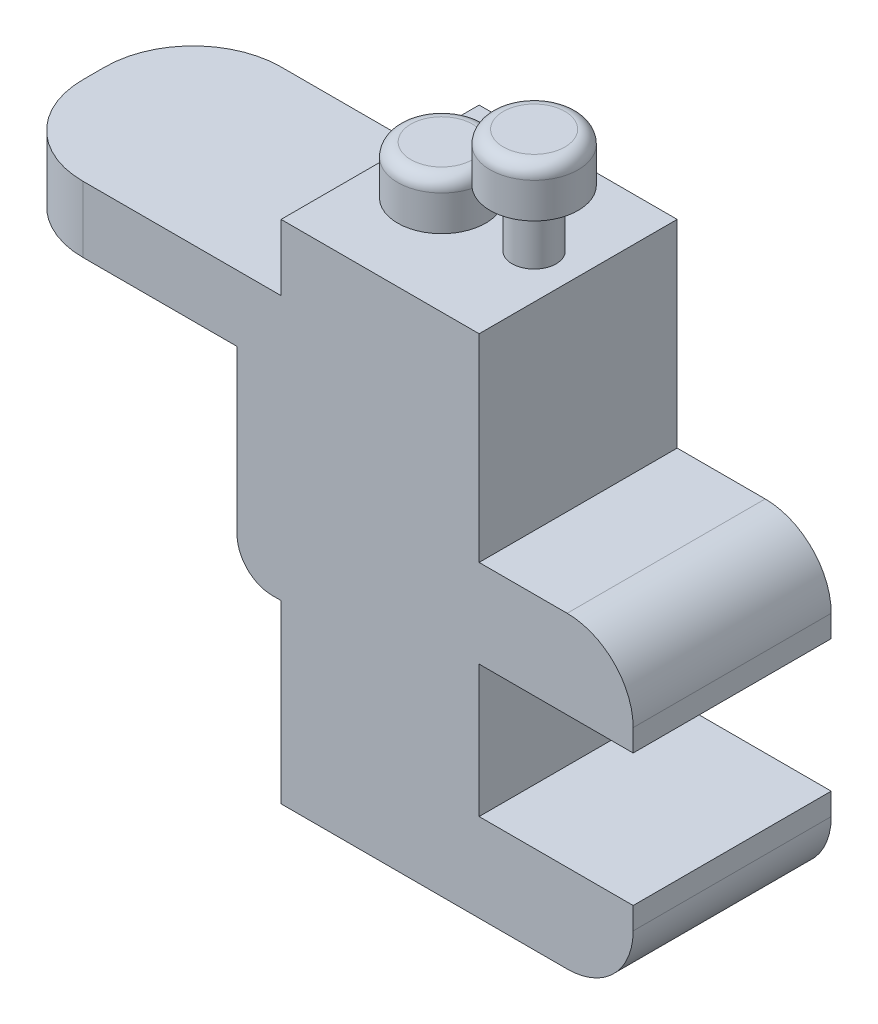
ISO-10303-21;
HEADER;
FILE_DESCRIPTION(('STEP AP214'),'2;1');
FILE_NAME('part.step','',(''),(''),'','','');
FILE_SCHEMA(('AUTOMOTIVE_DESIGN { 1 0 10303 214 1 1 1 1 }'));
ENDSEC;
DATA;
#1=APPLICATION_CONTEXT('core data for automotive mechanical design processes');
#2=APPLICATION_PROTOCOL_DEFINITION('international standard','automotive_design',2000,#1);
#3=PRODUCT_CONTEXT('',#1,'mechanical');
#4=PRODUCT('Part','Part','',(#3));
#5=PRODUCT_RELATED_PRODUCT_CATEGORY('part','',(#4));
#6=PRODUCT_DEFINITION_FORMATION('','',#4);
#7=PRODUCT_DEFINITION_CONTEXT('part definition',#1,'design');
#8=PRODUCT_DEFINITION('design','',#6,#7);
#9=PRODUCT_DEFINITION_SHAPE('','',#8);
#10=(LENGTH_UNIT() NAMED_UNIT(*) SI_UNIT(.MILLI.,.METRE.));
#11=(NAMED_UNIT(*) PLANE_ANGLE_UNIT() SI_UNIT($,.RADIAN.));
#12=(NAMED_UNIT(*) SI_UNIT($,.STERADIAN.) SOLID_ANGLE_UNIT());
#13=UNCERTAINTY_MEASURE_WITH_UNIT(LENGTH_MEASURE(1.E-05),#10,'distance_accuracy_value','');
#14=(GEOMETRIC_REPRESENTATION_CONTEXT(3) GLOBAL_UNCERTAINTY_ASSIGNED_CONTEXT((#13)) GLOBAL_UNIT_ASSIGNED_CONTEXT((#10,
#11,#12)) REPRESENTATION_CONTEXT('',''));
#15=CARTESIAN_POINT('',(0.,0.,0.));
#16=DIRECTION('',(0.,0.,1.));
#17=DIRECTION('',(1.,0.,0.));
#18=AXIS2_PLACEMENT_3D('',#15,#16,#17);
#19=CARTESIAN_POINT('',(-22.5,-57.5,-45.));
#20=DIRECTION('',(-1.,0.,0.));
#21=DIRECTION('',(0.,0.,1.));
#22=AXIS2_PLACEMENT_3D('',#19,#20,#21);
#23=PLANE('',#22);
#24=DIRECTION('',(0.,-1.,0.));
#25=VECTOR('',#24,1.);
#26=CARTESIAN_POINT('',(-22.5,-57.5,-45.));
#27=LINE('',#26,#25);
#28=CARTESIAN_POINT('',(-22.5,57.5,-45.));
#29=VERTEX_POINT('',#28);
#30=CARTESIAN_POINT('',(-22.5,42.5,-45.));
#31=VERTEX_POINT('',#30);
#32=EDGE_CURVE('E576',#29,#31,#27,.T.);
#33=ORIENTED_EDGE('',*,*,#32,.T.);
#34=DIRECTION('',(0.,0.,1.));
#35=VECTOR('',#34,1.);
#36=CARTESIAN_POINT('',(-22.5,42.5,-133.459030064771));
#37=LINE('',#36,#35);
#38=CARTESIAN_POINT('',(-22.5,42.5,0.));
#39=VERTEX_POINT('',#38);
#40=EDGE_CURVE('E209',#31,#39,#37,.T.);
#41=ORIENTED_EDGE('',*,*,#40,.T.);
#42=DIRECTION('',(0.,-1.,0.));
#43=VECTOR('',#42,1.);
#44=CARTESIAN_POINT('',(-22.5,-57.5,0.));
#45=LINE('',#44,#43);
#46=CARTESIAN_POINT('',(-22.5,57.5,0.));
#47=VERTEX_POINT('',#46);
#48=EDGE_CURVE('E216',#47,#39,#45,.T.);
#49=ORIENTED_EDGE('',*,*,#48,.F.);
#50=DIRECTION('',(0.,0.,1.));
#51=VECTOR('',#50,1.);
#52=CARTESIAN_POINT('',(-22.5,57.5,-45.));
#53=LINE('',#52,#51);
#54=EDGE_CURVE('E234',#29,#47,#53,.T.);
#55=ORIENTED_EDGE('',*,*,#54,.F.);
#56=EDGE_LOOP('',(#33,#41,#49,#55));
#57=FACE_BOUND('',#56,.T.);
#58=ADVANCED_FACE('F44',(#57),#23,.T.);
#59=CARTESIAN_POINT('',(22.5,-57.5,-45.));
#60=DIRECTION('',(1.,0.,0.));
#61=DIRECTION('',(0.,0.,-1.));
#62=AXIS2_PLACEMENT_3D('',#59,#60,#61);
#63=PLANE('',#62);
#64=DIRECTION('',(0.,1.,0.));
#65=VECTOR('',#64,1.);
#66=CARTESIAN_POINT('',(22.5,-57.5,-45.));
#67=LINE('',#66,#65);
#68=CARTESIAN_POINT('',(22.5,-37.5,-45.));
#69=VERTEX_POINT('',#68);
#70=CARTESIAN_POINT('',(22.5,-7.49999999999999,-45.));
#71=VERTEX_POINT('',#70);
#72=EDGE_CURVE('E567',#69,#71,#67,.T.);
#73=ORIENTED_EDGE('',*,*,#72,.T.);
#74=DIRECTION('',(0.,0.,-1.));
#75=VECTOR('',#74,1.);
#76=CARTESIAN_POINT('',(22.5,-7.49999999999999,0.));
#77=LINE('',#76,#75);
#78=CARTESIAN_POINT('',(22.5,-7.49999999999999,0.));
#79=VERTEX_POINT('',#78);
#80=EDGE_CURVE('E532',#79,#71,#77,.T.);
#81=ORIENTED_EDGE('',*,*,#80,.F.);
#82=DIRECTION('',(0.,1.,0.));
#83=VECTOR('',#82,1.);
#84=CARTESIAN_POINT('',(22.5,-57.5,0.));
#85=LINE('',#84,#83);
#86=CARTESIAN_POINT('',(22.5,-37.5,0.));
#87=VERTEX_POINT('',#86);
#88=EDGE_CURVE('E224',#87,#79,#85,.T.);
#89=ORIENTED_EDGE('',*,*,#88,.F.);
#90=DIRECTION('',(0.,0.,1.));
#91=VECTOR('',#90,1.);
#92=CARTESIAN_POINT('',(22.5,-37.5,0.));
#93=LINE('',#92,#91);
#94=EDGE_CURVE('E536',#69,#87,#93,.T.);
#95=ORIENTED_EDGE('',*,*,#94,.F.);
#96=EDGE_LOOP('',(#73,#81,#89,#95));
#97=FACE_BOUND('',#96,.T.);
#98=ADVANCED_FACE('F334',(#97),#63,.T.);
#99=CARTESIAN_POINT('',(22.5,12.5,0.));
#100=VERTEX_POINT('',#99);
#101=CARTESIAN_POINT('',(22.5,57.5,0.));
#102=VERTEX_POINT('',#101);
#103=EDGE_CURVE('E566',#100,#102,#85,.T.);
#104=ORIENTED_EDGE('',*,*,#103,.F.);
#105=DIRECTION('',(0.,0.,1.));
#106=VECTOR('',#105,1.);
#107=CARTESIAN_POINT('',(22.5,12.5,0.));
#108=LINE('',#107,#106);
#109=CARTESIAN_POINT('',(22.5,12.5,-45.));
#110=VERTEX_POINT('',#109);
#111=EDGE_CURVE('E528',#110,#100,#108,.T.);
#112=ORIENTED_EDGE('',*,*,#111,.F.);
#113=CARTESIAN_POINT('',(22.5,57.5,-45.));
#114=VERTEX_POINT('',#113);
#115=EDGE_CURVE('E230',#110,#114,#67,.T.);
#116=ORIENTED_EDGE('',*,*,#115,.T.);
#117=DIRECTION('',(0.,0.,1.));
#118=VECTOR('',#117,1.);
#119=CARTESIAN_POINT('',(22.5,57.5,-45.));
#120=LINE('',#119,#118);
#121=EDGE_CURVE('E237',#114,#102,#120,.T.);
#122=ORIENTED_EDGE('',*,*,#121,.T.);
#123=EDGE_LOOP('',(#104,#112,#116,#122));
#124=FACE_BOUND('',#123,.T.);
#125=ADVANCED_FACE('F340',(#124),#63,.T.);
#126=CARTESIAN_POINT('',(-22.5,-57.5,-45.));
#127=DIRECTION('',(0.,-1.,0.));
#128=DIRECTION('',(0.,0.,-1.));
#129=AXIS2_PLACEMENT_3D('',#126,#127,#128);
#130=PLANE('',#129);
#131=DIRECTION('',(1.,0.,0.));
#132=VECTOR('',#131,1.);
#133=CARTESIAN_POINT('',(-22.5,-57.5,-45.));
#134=LINE('',#133,#132);
#135=CARTESIAN_POINT('',(-22.5,-57.5,-45.));
#136=VERTEX_POINT('',#135);
#137=CARTESIAN_POINT('',(42.5,-57.5,-45.));
#138=VERTEX_POINT('',#137);
#139=EDGE_CURVE('E241',#136,#138,#134,.T.);
#140=ORIENTED_EDGE('',*,*,#139,.T.);
#141=DIRECTION('',(0.,0.,-1.));
#142=VECTOR('',#141,1.);
#143=CARTESIAN_POINT('',(42.5,-57.5,0.));
#144=LINE('',#143,#142);
#145=CARTESIAN_POINT('',(42.5,-57.5,0.));
#146=VERTEX_POINT('',#145);
#147=EDGE_CURVE('E289',#138,#146,#144,.F.);
#148=ORIENTED_EDGE('',*,*,#147,.T.);
#149=DIRECTION('',(1.,0.,0.));
#150=VECTOR('',#149,1.);
#151=CARTESIAN_POINT('',(-22.5,-57.5,0.));
#152=LINE('',#151,#150);
#153=CARTESIAN_POINT('',(-22.5,-57.5,0.));
#154=VERTEX_POINT('',#153);
#155=EDGE_CURVE('E222',#154,#146,#152,.T.);
#156=ORIENTED_EDGE('',*,*,#155,.F.);
#157=DIRECTION('',(0.,0.,1.));
#158=VECTOR('',#157,1.);
#159=CARTESIAN_POINT('',(-22.5,-57.5,-45.));
#160=LINE('',#159,#158);
#161=EDGE_CURVE('E213',#136,#154,#160,.T.);
#162=ORIENTED_EDGE('',*,*,#161,.F.);
#163=EDGE_LOOP('',(#140,#148,#156,#162));
#164=FACE_BOUND('',#163,.T.);
#165=ADVANCED_FACE('F348',(#164),#130,.T.);
#166=DIRECTION('',(0.,0.,1.));
#167=VECTOR('',#166,1.);
#168=CARTESIAN_POINT('',(-22.5,-17.5,-133.459030064771));
#169=LINE('',#168,#167);
#170=CARTESIAN_POINT('',(-22.5,-17.5,-45.));
#171=VERTEX_POINT('',#170);
#172=CARTESIAN_POINT('',(-22.5,-17.5,0.));
#173=VERTEX_POINT('',#172);
#174=EDGE_CURVE('E202',#171,#173,#169,.T.);
#175=ORIENTED_EDGE('',*,*,#174,.F.);
#176=EDGE_CURVE('E575',#171,#136,#27,.T.);
#177=ORIENTED_EDGE('',*,*,#176,.T.);
#178=ORIENTED_EDGE('',*,*,#161,.T.);
#179=EDGE_CURVE('E191',#173,#154,#45,.T.);
#180=ORIENTED_EDGE('',*,*,#179,.F.);
#181=EDGE_LOOP('',(#175,#177,#178,#180));
#182=FACE_BOUND('',#181,.T.);
#183=ADVANCED_FACE('F211',(#182),#23,.T.);
#184=CARTESIAN_POINT('',(-22.5,57.5,-45.));
#185=DIRECTION('',(0.,1.,0.));
#186=DIRECTION('',(0.,0.,1.));
#187=AXIS2_PLACEMENT_3D('',#184,#185,#186);
#188=PLANE('',#187);
#189=CARTESIAN_POINT('',(12.5,57.5,-22.5));
#190=DIRECTION('',(0.,1.,0.));
#191=DIRECTION('',(0.,0.,1.));
#192=AXIS2_PLACEMENT_3D('',#189,#190,#191);
#193=CIRCLE('',#192,5.);
#194=CARTESIAN_POINT('',(12.5,57.5,-27.5));
#195=VERTEX_POINT('',#194);
#196=EDGE_CURVE('E602',#195,#195,#193,.T.);
#197=ORIENTED_EDGE('',*,*,#196,.F.);
#198=EDGE_LOOP('',(#197));
#199=FACE_BOUND('',#198,.T.);
#200=CARTESIAN_POINT('',(-8.49999999999999,57.5,-22.5));
#201=DIRECTION('',(0.,1.,0.));
#202=DIRECTION('',(0.,0.,1.));
#203=AXIS2_PLACEMENT_3D('',#200,#201,#202);
#204=CIRCLE('',#203,10.);
#205=CARTESIAN_POINT('',(-8.49999999999999,57.5,-12.5));
#206=VERTEX_POINT('',#205);
#207=EDGE_CURVE('E481',#206,#206,#204,.T.);
#208=ORIENTED_EDGE('',*,*,#207,.F.);
#209=EDGE_LOOP('',(#208));
#210=FACE_BOUND('',#209,.T.);
#211=DIRECTION('',(-1.,0.,0.));
#212=VECTOR('',#211,1.);
#213=CARTESIAN_POINT('',(-22.5,57.5,0.));
#214=LINE('',#213,#212);
#215=EDGE_CURVE('E217',#102,#47,#214,.T.);
#216=ORIENTED_EDGE('',*,*,#215,.F.);
#217=ORIENTED_EDGE('',*,*,#121,.F.);
#218=DIRECTION('',(-1.,0.,0.));
#219=VECTOR('',#218,1.);
#220=CARTESIAN_POINT('',(-22.5,57.5,-45.));
#221=LINE('',#220,#219);
#222=EDGE_CURVE('E571',#114,#29,#221,.T.);
#223=ORIENTED_EDGE('',*,*,#222,.T.);
#224=ORIENTED_EDGE('',*,*,#54,.T.);
#225=EDGE_LOOP('',(#216,#217,#223,#224));
#226=FACE_BOUND('',#225,.T.);
#227=ADVANCED_FACE('F347',(#199,#210,#226),#188,.T.);
#228=CARTESIAN_POINT('',(0.,0.,-45.));
#229=DIRECTION('',(0.,0.,-1.));
#230=DIRECTION('',(-1.,0.,0.));
#231=AXIS2_PLACEMENT_3D('',#228,#229,#230);
#232=PLANE('',#231);
#233=DIRECTION('',(0.,1.,0.));
#234=VECTOR('',#233,1.);
#235=CARTESIAN_POINT('',(57.5,-57.5,-45.));
#236=LINE('',#235,#234);
#237=CARTESIAN_POINT('',(57.5,-42.5,-45.));
#238=VERTEX_POINT('',#237);
#239=CARTESIAN_POINT('',(57.5,-37.5,-45.));
#240=VERTEX_POINT('',#239);
#241=EDGE_CURVE('E549',#238,#240,#236,.T.);
#242=ORIENTED_EDGE('',*,*,#241,.F.);
#243=CARTESIAN_POINT('',(42.5,-42.5,-45.));
#244=DIRECTION('',(0.,0.,-1.));
#245=DIRECTION('',(-1.,0.,0.));
#246=AXIS2_PLACEMENT_3D('',#243,#244,#245);
#247=CIRCLE('',#246,15.);
#248=EDGE_CURVE('E286',#238,#138,#247,.T.);
#249=ORIENTED_EDGE('',*,*,#248,.T.);
#250=ORIENTED_EDGE('',*,*,#139,.F.);
#251=ORIENTED_EDGE('',*,*,#176,.F.);
#252=DIRECTION('',(1.,0.,0.));
#253=VECTOR('',#252,1.);
#254=CARTESIAN_POINT('',(-22.5,-17.5,-45.));
#255=LINE('',#254,#253);
#256=CARTESIAN_POINT('',(-24.5,-17.5,-45.));
#257=VERTEX_POINT('',#256);
#258=EDGE_CURVE('E205',#257,#171,#255,.T.);
#259=ORIENTED_EDGE('',*,*,#258,.F.);
#260=CARTESIAN_POINT('',(-24.5,-9.5,-45.));
#261=DIRECTION('',(0.,0.,-1.));
#262=DIRECTION('',(-1.,0.,0.));
#263=AXIS2_PLACEMENT_3D('',#260,#261,#262);
#264=CIRCLE('',#263,8.);
#265=CARTESIAN_POINT('',(-32.5,-9.5,-45.));
#266=VERTEX_POINT('',#265);
#267=EDGE_CURVE('E276',#257,#266,#264,.T.);
#268=ORIENTED_EDGE('',*,*,#267,.T.);
#269=DIRECTION('',(0.,-1.,0.));
#270=VECTOR('',#269,1.);
#271=CARTESIAN_POINT('',(-32.5,-17.5,-45.));
#272=LINE('',#271,#270);
#273=CARTESIAN_POINT('',(-32.5,27.5,-45.));
#274=VERTEX_POINT('',#273);
#275=EDGE_CURVE('E495',#274,#266,#272,.T.);
#276=ORIENTED_EDGE('',*,*,#275,.F.);
#277=DIRECTION('',(1.,0.,0.));
#278=VECTOR('',#277,1.);
#279=CARTESIAN_POINT('',(-32.5,27.5,-45.));
#280=LINE('',#279,#278);
#281=CARTESIAN_POINT('',(-67.5,27.5,-45.));
#282=VERTEX_POINT('',#281);
#283=EDGE_CURVE('E500',#282,#274,#280,.T.);
#284=ORIENTED_EDGE('',*,*,#283,.F.);
#285=DIRECTION('',(0.,-1.,0.));
#286=VECTOR('',#285,1.);
#287=CARTESIAN_POINT('',(-67.5,0.,-45.));
#288=LINE('',#287,#286);
#289=CARTESIAN_POINT('',(-67.5,42.5,-45.));
#290=VERTEX_POINT('',#289);
#291=EDGE_CURVE('E254',#282,#290,#288,.F.);
#292=ORIENTED_EDGE('',*,*,#291,.T.);
#293=DIRECTION('',(-1.,0.,0.));
#294=VECTOR('',#293,1.);
#295=CARTESIAN_POINT('',(-87.5,42.5,-45.));
#296=LINE('',#295,#294);
#297=EDGE_CURVE('E198',#31,#290,#296,.T.);
#298=ORIENTED_EDGE('',*,*,#297,.F.);
#299=ORIENTED_EDGE('',*,*,#32,.F.);
#300=ORIENTED_EDGE('',*,*,#222,.F.);
#301=ORIENTED_EDGE('',*,*,#115,.F.);
#302=DIRECTION('',(-1.,0.,0.));
#303=VECTOR('',#302,1.);
#304=CARTESIAN_POINT('',(57.5,12.5,-45.));
#305=LINE('',#304,#303);
#306=CARTESIAN_POINT('',(42.5,12.5,-45.));
#307=VERTEX_POINT('',#306);
#308=EDGE_CURVE('E521',#307,#110,#305,.T.);
#309=ORIENTED_EDGE('',*,*,#308,.F.);
#310=CARTESIAN_POINT('',(42.5,-2.49999999999999,-45.));
#311=DIRECTION('',(0.,0.,-1.));
#312=DIRECTION('',(-1.,0.,0.));
#313=AXIS2_PLACEMENT_3D('',#310,#311,#312);
#314=CIRCLE('',#313,15.);
#315=CARTESIAN_POINT('',(57.5,-2.49999999999999,-45.));
#316=VERTEX_POINT('',#315);
#317=EDGE_CURVE('E283',#307,#316,#314,.T.);
#318=ORIENTED_EDGE('',*,*,#317,.T.);
#319=DIRECTION('',(0.,1.,0.));
#320=VECTOR('',#319,1.);
#321=CARTESIAN_POINT('',(57.5,-7.49999999999999,-45.));
#322=LINE('',#321,#320);
#323=CARTESIAN_POINT('',(57.5,-7.49999999999999,-45.));
#324=VERTEX_POINT('',#323);
#325=EDGE_CURVE('E527',#324,#316,#322,.T.);
#326=ORIENTED_EDGE('',*,*,#325,.F.);
#327=DIRECTION('',(-1.,0.,0.));
#328=VECTOR('',#327,1.);
#329=CARTESIAN_POINT('',(57.5,-7.49999999999999,-45.));
#330=LINE('',#329,#328);
#331=EDGE_CURVE('E517',#324,#71,#330,.T.);
#332=ORIENTED_EDGE('',*,*,#331,.T.);
#333=ORIENTED_EDGE('',*,*,#72,.F.);
#334=DIRECTION('',(-1.,0.,0.));
#335=VECTOR('',#334,1.);
#336=CARTESIAN_POINT('',(57.5,-37.5,-45.));
#337=LINE('',#336,#335);
#338=EDGE_CURVE('E562',#240,#69,#337,.T.);
#339=ORIENTED_EDGE('',*,*,#338,.F.);
#340=EDGE_LOOP('',(#242,#249,#250,#251,#259,#268,#276,#284,#292,#298,#299,#300,#301,#309,#318,
#326,#332,#333,#339));
#341=FACE_BOUND('',#340,.T.);
#342=ADVANCED_FACE('F353',(#341),#232,.T.);
#343=CARTESIAN_POINT('',(0.,0.,0.));
#344=DIRECTION('',(0.,0.,-1.));
#345=DIRECTION('',(-1.,0.,0.));
#346=AXIS2_PLACEMENT_3D('',#343,#344,#345);
#347=PLANE('',#346);
#348=ORIENTED_EDGE('',*,*,#155,.T.);
#349=CARTESIAN_POINT('',(42.5,-42.5,0.));
#350=DIRECTION('',(0.,0.,-1.));
#351=DIRECTION('',(-1.,0.,0.));
#352=AXIS2_PLACEMENT_3D('',#349,#350,#351);
#353=CIRCLE('',#352,15.);
#354=CARTESIAN_POINT('',(57.5,-42.5,0.));
#355=VERTEX_POINT('',#354);
#356=EDGE_CURVE('E294',#146,#355,#353,.F.);
#357=ORIENTED_EDGE('',*,*,#356,.T.);
#358=DIRECTION('',(0.,-1.,0.));
#359=VECTOR('',#358,1.);
#360=CARTESIAN_POINT('',(57.5,-57.5,0.));
#361=LINE('',#360,#359);
#362=CARTESIAN_POINT('',(57.5,-37.5,0.));
#363=VERTEX_POINT('',#362);
#364=EDGE_CURVE('E545',#363,#355,#361,.T.);
#365=ORIENTED_EDGE('',*,*,#364,.F.);
#366=DIRECTION('',(-1.,0.,0.));
#367=VECTOR('',#366,1.);
#368=CARTESIAN_POINT('',(57.5,-37.5,0.));
#369=LINE('',#368,#367);
#370=EDGE_CURVE('E555',#363,#87,#369,.T.);
#371=ORIENTED_EDGE('',*,*,#370,.T.);
#372=ORIENTED_EDGE('',*,*,#88,.T.);
#373=DIRECTION('',(-1.,0.,0.));
#374=VECTOR('',#373,1.);
#375=CARTESIAN_POINT('',(57.5,-7.49999999999999,0.));
#376=LINE('',#375,#374);
#377=CARTESIAN_POINT('',(57.5,-7.49999999999999,0.));
#378=VERTEX_POINT('',#377);
#379=EDGE_CURVE('E514',#378,#79,#376,.T.);
#380=ORIENTED_EDGE('',*,*,#379,.F.);
#381=DIRECTION('',(0.,-1.,0.));
#382=VECTOR('',#381,1.);
#383=CARTESIAN_POINT('',(57.5,-7.49999999999999,0.));
#384=LINE('',#383,#382);
#385=CARTESIAN_POINT('',(57.5,-2.49999999999999,0.));
#386=VERTEX_POINT('',#385);
#387=EDGE_CURVE('E533',#386,#378,#384,.T.);
#388=ORIENTED_EDGE('',*,*,#387,.F.);
#389=CARTESIAN_POINT('',(42.5,-2.49999999999999,0.));
#390=DIRECTION('',(0.,0.,-1.));
#391=DIRECTION('',(-1.,0.,0.));
#392=AXIS2_PLACEMENT_3D('',#389,#390,#391);
#393=CIRCLE('',#392,15.);
#394=CARTESIAN_POINT('',(42.5,12.5,0.));
#395=VERTEX_POINT('',#394);
#396=EDGE_CURVE('E60',#386,#395,#393,.F.);
#397=ORIENTED_EDGE('',*,*,#396,.T.);
#398=DIRECTION('',(-1.,0.,0.));
#399=VECTOR('',#398,1.);
#400=CARTESIAN_POINT('',(57.5,12.5,0.));
#401=LINE('',#400,#399);
#402=EDGE_CURVE('E524',#395,#100,#401,.T.);
#403=ORIENTED_EDGE('',*,*,#402,.T.);
#404=ORIENTED_EDGE('',*,*,#103,.T.);
#405=ORIENTED_EDGE('',*,*,#215,.T.);
#406=ORIENTED_EDGE('',*,*,#48,.T.);
#407=DIRECTION('',(-1.,0.,0.));
#408=VECTOR('',#407,1.);
#409=CARTESIAN_POINT('',(-87.5,42.5,0.));
#410=LINE('',#409,#408);
#411=CARTESIAN_POINT('',(-67.5,42.5,0.));
#412=VERTEX_POINT('',#411);
#413=EDGE_CURVE('E473',#39,#412,#410,.T.);
#414=ORIENTED_EDGE('',*,*,#413,.T.);
#415=DIRECTION('',(0.,-1.,0.));
#416=VECTOR('',#415,1.);
#417=CARTESIAN_POINT('',(-67.5,27.5,0.));
#418=LINE('',#417,#416);
#419=CARTESIAN_POINT('',(-67.5,27.5,0.));
#420=VERTEX_POINT('',#419);
#421=EDGE_CURVE('E263',#412,#420,#418,.T.);
#422=ORIENTED_EDGE('',*,*,#421,.T.);
#423=DIRECTION('',(1.,0.,0.));
#424=VECTOR('',#423,1.);
#425=CARTESIAN_POINT('',(-32.5,27.5,0.));
#426=LINE('',#425,#424);
#427=CARTESIAN_POINT('',(-32.5,27.5,0.));
#428=VERTEX_POINT('',#427);
#429=EDGE_CURVE('E480',#420,#428,#426,.T.);
#430=ORIENTED_EDGE('',*,*,#429,.T.);
#431=DIRECTION('',(0.,-1.,0.));
#432=VECTOR('',#431,1.);
#433=CARTESIAN_POINT('',(-32.5,-17.5,0.));
#434=LINE('',#433,#432);
#435=CARTESIAN_POINT('',(-32.5,-9.50000000000001,0.));
#436=VERTEX_POINT('',#435);
#437=EDGE_CURVE('E199',#428,#436,#434,.T.);
#438=ORIENTED_EDGE('',*,*,#437,.T.);
#439=CARTESIAN_POINT('',(-24.5,-9.5,0.));
#440=DIRECTION('',(0.,0.,-1.));
#441=DIRECTION('',(-1.,0.,0.));
#442=AXIS2_PLACEMENT_3D('',#439,#440,#441);
#443=CIRCLE('',#442,8.);
#444=CARTESIAN_POINT('',(-24.5,-17.5,0.));
#445=VERTEX_POINT('',#444);
#446=EDGE_CURVE('E194',#436,#445,#443,.F.);
#447=ORIENTED_EDGE('',*,*,#446,.T.);
#448=DIRECTION('',(1.,0.,0.));
#449=VECTOR('',#448,1.);
#450=CARTESIAN_POINT('',(-22.5,-17.5,0.));
#451=LINE('',#450,#449);
#452=EDGE_CURVE('E186',#445,#173,#451,.T.);
#453=ORIENTED_EDGE('',*,*,#452,.T.);
#454=ORIENTED_EDGE('',*,*,#179,.T.);
#455=EDGE_LOOP('',(#348,#357,#365,#371,#372,#380,#388,#397,#403,#404,#405,#406,#414,#422,#430,
#438,#447,#453,#454));
#456=FACE_BOUND('',#455,.T.);
#457=ADVANCED_FACE('F189',(#456),#347,.F.);
#458=CARTESIAN_POINT('',(57.5,-37.5,0.));
#459=DIRECTION('',(0.,-1.,0.));
#460=DIRECTION('',(0.,0.,-1.));
#461=AXIS2_PLACEMENT_3D('',#458,#459,#460);
#462=PLANE('',#461);
#463=ORIENTED_EDGE('',*,*,#94,.T.);
#464=ORIENTED_EDGE('',*,*,#370,.F.);
#465=DIRECTION('',(0.,0.,1.));
#466=VECTOR('',#465,1.);
#467=CARTESIAN_POINT('',(57.5,-37.5,0.));
#468=LINE('',#467,#466);
#469=EDGE_CURVE('E552',#240,#363,#468,.T.);
#470=ORIENTED_EDGE('',*,*,#469,.F.);
#471=ORIENTED_EDGE('',*,*,#338,.T.);
#472=EDGE_LOOP('',(#463,#464,#470,#471));
#473=FACE_BOUND('',#472,.T.);
#474=ADVANCED_FACE('F366',(#473),#462,.F.);
#475=CARTESIAN_POINT('',(57.5,0.,0.));
#476=DIRECTION('',(-1.,0.,0.));
#477=DIRECTION('',(0.,0.,1.));
#478=AXIS2_PLACEMENT_3D('',#475,#476,#477);
#479=PLANE('',#478);
#480=ORIENTED_EDGE('',*,*,#364,.T.);
#481=DIRECTION('',(0.,0.,-1.));
#482=VECTOR('',#481,1.);
#483=CARTESIAN_POINT('',(57.5,-42.5,-45.));
#484=LINE('',#483,#482);
#485=EDGE_CURVE('E279',#355,#238,#484,.T.);
#486=ORIENTED_EDGE('',*,*,#485,.T.);
#487=ORIENTED_EDGE('',*,*,#241,.T.);
#488=ORIENTED_EDGE('',*,*,#469,.T.);
#489=EDGE_LOOP('',(#480,#486,#487,#488));
#490=FACE_BOUND('',#489,.T.);
#491=ADVANCED_FACE('F371',(#490),#479,.F.);
#492=CARTESIAN_POINT('',(57.5,-7.49999999999999,0.));
#493=DIRECTION('',(0.,1.,0.));
#494=DIRECTION('',(0.,0.,1.));
#495=AXIS2_PLACEMENT_3D('',#492,#493,#494);
#496=PLANE('',#495);
#497=ORIENTED_EDGE('',*,*,#80,.T.);
#498=ORIENTED_EDGE('',*,*,#331,.F.);
#499=DIRECTION('',(0.,0.,-1.));
#500=VECTOR('',#499,1.);
#501=CARTESIAN_POINT('',(57.5,-7.49999999999999,0.));
#502=LINE('',#501,#500);
#503=EDGE_CURVE('E540',#378,#324,#502,.T.);
#504=ORIENTED_EDGE('',*,*,#503,.F.);
#505=ORIENTED_EDGE('',*,*,#379,.T.);
#506=EDGE_LOOP('',(#497,#498,#504,#505));
#507=FACE_BOUND('',#506,.T.);
#508=ADVANCED_FACE('F375',(#507),#496,.F.);
#509=CARTESIAN_POINT('',(57.5,12.5,0.));
#510=DIRECTION('',(0.,-1.,0.));
#511=DIRECTION('',(0.,0.,-1.));
#512=AXIS2_PLACEMENT_3D('',#509,#510,#511);
#513=PLANE('',#512);
#514=ORIENTED_EDGE('',*,*,#402,.F.);
#515=DIRECTION('',(0.,0.,1.));
#516=VECTOR('',#515,1.);
#517=CARTESIAN_POINT('',(42.5,12.5,0.));
#518=LINE('',#517,#516);
#519=EDGE_CURVE('E300',#395,#307,#518,.F.);
#520=ORIENTED_EDGE('',*,*,#519,.T.);
#521=ORIENTED_EDGE('',*,*,#308,.T.);
#522=ORIENTED_EDGE('',*,*,#111,.T.);
#523=EDGE_LOOP('',(#514,#520,#521,#522));
#524=FACE_BOUND('',#523,.T.);
#525=ADVANCED_FACE('F381',(#524),#513,.F.);
#526=CARTESIAN_POINT('',(57.5,0.,0.));
#527=DIRECTION('',(-1.,0.,0.));
#528=DIRECTION('',(0.,0.,1.));
#529=AXIS2_PLACEMENT_3D('',#526,#527,#528);
#530=PLANE('',#529);
#531=ORIENTED_EDGE('',*,*,#325,.T.);
#532=DIRECTION('',(0.,0.,1.));
#533=VECTOR('',#532,1.);
#534=CARTESIAN_POINT('',(57.5,-2.49999999999999,0.));
#535=LINE('',#534,#533);
#536=EDGE_CURVE('E297',#316,#386,#535,.T.);
#537=ORIENTED_EDGE('',*,*,#536,.T.);
#538=ORIENTED_EDGE('',*,*,#387,.T.);
#539=ORIENTED_EDGE('',*,*,#503,.T.);
#540=EDGE_LOOP('',(#531,#537,#538,#539));
#541=FACE_BOUND('',#540,.T.);
#542=ADVANCED_FACE('F377',(#541),#530,.F.);
#543=CARTESIAN_POINT('',(-87.5,42.5,-133.459030064771));
#544=DIRECTION('',(0.,1.,0.));
#545=DIRECTION('',(0.,0.,1.));
#546=AXIS2_PLACEMENT_3D('',#543,#544,#545);
#547=PLANE('',#546);
#548=ORIENTED_EDGE('',*,*,#297,.T.);
#549=CARTESIAN_POINT('',(-67.5,42.5,-25.));
#550=DIRECTION('',(0.,1.,0.));
#551=DIRECTION('',(0.,0.,1.));
#552=AXIS2_PLACEMENT_3D('',#549,#550,#551);
#553=CIRCLE('',#552,20.);
#554=CARTESIAN_POINT('',(-87.5,42.5,-25.));
#555=VERTEX_POINT('',#554);
#556=EDGE_CURVE('E260',#290,#555,#553,.T.);
#557=ORIENTED_EDGE('',*,*,#556,.T.);
#558=DIRECTION('',(0.,0.,1.));
#559=VECTOR('',#558,1.);
#560=CARTESIAN_POINT('',(-87.5,42.5,-133.459030064771));
#561=LINE('',#560,#559);
#562=CARTESIAN_POINT('',(-87.5,42.5,-20.));
#563=VERTEX_POINT('',#562);
#564=EDGE_CURVE('E476',#555,#563,#561,.T.);
#565=ORIENTED_EDGE('',*,*,#564,.T.);
#566=CARTESIAN_POINT('',(-67.5,42.5,-20.));
#567=DIRECTION('',(0.,1.,0.));
#568=DIRECTION('',(0.,0.,1.));
#569=AXIS2_PLACEMENT_3D('',#566,#567,#568);
#570=CIRCLE('',#569,20.);
#571=EDGE_CURVE('E257',#563,#412,#570,.T.);
#572=ORIENTED_EDGE('',*,*,#571,.T.);
#573=ORIENTED_EDGE('',*,*,#413,.F.);
#574=ORIENTED_EDGE('',*,*,#40,.F.);
#575=EDGE_LOOP('',(#548,#557,#565,#572,#573,#574));
#576=FACE_BOUND('',#575,.T.);
#577=ADVANCED_FACE('F380',(#576),#547,.T.);
#578=CARTESIAN_POINT('',(-87.5,27.5,-133.459030064771));
#579=DIRECTION('',(-1.,0.,0.));
#580=DIRECTION('',(0.,0.,1.));
#581=AXIS2_PLACEMENT_3D('',#578,#579,#580);
#582=PLANE('',#581);
#583=ORIENTED_EDGE('',*,*,#564,.F.);
#584=DIRECTION('',(0.,-1.,0.));
#585=VECTOR('',#584,1.);
#586=CARTESIAN_POINT('',(-87.5,27.5,-25.));
#587=LINE('',#586,#585);
#588=CARTESIAN_POINT('',(-87.5,27.5,-25.));
#589=VERTEX_POINT('',#588);
#590=EDGE_CURVE('E244',#555,#589,#587,.T.);
#591=ORIENTED_EDGE('',*,*,#590,.T.);
#592=DIRECTION('',(0.,0.,1.));
#593=VECTOR('',#592,1.);
#594=CARTESIAN_POINT('',(-87.5,27.5,-133.459030064771));
#595=LINE('',#594,#593);
#596=CARTESIAN_POINT('',(-87.5,27.5,-20.));
#597=VERTEX_POINT('',#596);
#598=EDGE_CURVE('E502',#589,#597,#595,.T.);
#599=ORIENTED_EDGE('',*,*,#598,.T.);
#600=DIRECTION('',(0.,-1.,0.));
#601=VECTOR('',#600,1.);
#602=CARTESIAN_POINT('',(-87.5,42.5,-20.));
#603=LINE('',#602,#601);
#604=EDGE_CURVE('E233',#597,#563,#603,.F.);
#605=ORIENTED_EDGE('',*,*,#604,.T.);
#606=EDGE_LOOP('',(#583,#591,#599,#605));
#607=FACE_BOUND('',#606,.T.);
#608=ADVANCED_FACE('F391',(#607),#582,.T.);
#609=CARTESIAN_POINT('',(-32.5,27.5,-133.459030064771));
#610=DIRECTION('',(0.,-1.,0.));
#611=DIRECTION('',(1.,0.,0.));
#612=AXIS2_PLACEMENT_3D('',#609,#610,#611);
#613=PLANE('',#612);
#614=CARTESIAN_POINT('',(-60.,27.5,-22.5));
#615=DIRECTION('',(0.,-1.,0.));
#616=DIRECTION('',(1.,0.,0.));
#617=AXIS2_PLACEMENT_3D('',#614,#615,#616);
#618=CIRCLE('',#617,10.);
#619=CARTESIAN_POINT('',(-50.,27.5,-22.5));
#620=VERTEX_POINT('',#619);
#621=EDGE_CURVE('E613',#620,#620,#618,.T.);
#622=ORIENTED_EDGE('',*,*,#621,.F.);
#623=EDGE_LOOP('',(#622));
#624=FACE_BOUND('',#623,.T.);
#625=ORIENTED_EDGE('',*,*,#598,.F.);
#626=CARTESIAN_POINT('',(-67.5,27.5,-25.));
#627=DIRECTION('',(0.,-1.,0.));
#628=DIRECTION('',(1.,0.,0.));
#629=AXIS2_PLACEMENT_3D('',#626,#627,#628);
#630=CIRCLE('',#629,20.);
#631=EDGE_CURVE('E251',#589,#282,#630,.T.);
#632=ORIENTED_EDGE('',*,*,#631,.T.);
#633=ORIENTED_EDGE('',*,*,#283,.T.);
#634=DIRECTION('',(0.,0.,1.));
#635=VECTOR('',#634,1.);
#636=CARTESIAN_POINT('',(-32.5,27.5,-133.459030064771));
#637=LINE('',#636,#635);
#638=EDGE_CURVE('E499',#274,#428,#637,.T.);
#639=ORIENTED_EDGE('',*,*,#638,.T.);
#640=ORIENTED_EDGE('',*,*,#429,.F.);
#641=CARTESIAN_POINT('',(-67.5,27.5,-20.));
#642=DIRECTION('',(0.,-1.,0.));
#643=DIRECTION('',(1.,0.,0.));
#644=AXIS2_PLACEMENT_3D('',#641,#642,#643);
#645=CIRCLE('',#644,20.);
#646=EDGE_CURVE('E248',#420,#597,#645,.T.);
#647=ORIENTED_EDGE('',*,*,#646,.T.);
#648=EDGE_LOOP('',(#625,#632,#633,#639,#640,#647));
#649=FACE_BOUND('',#648,.T.);
#650=ADVANCED_FACE('F395',(#624,#649),#613,.T.);
#651=CARTESIAN_POINT('',(-32.5,-17.5,-133.459030064771));
#652=DIRECTION('',(-1.,0.,0.));
#653=DIRECTION('',(0.,0.,1.));
#654=AXIS2_PLACEMENT_3D('',#651,#652,#653);
#655=PLANE('',#654);
#656=ORIENTED_EDGE('',*,*,#275,.T.);
#657=DIRECTION('',(0.,0.,1.));
#658=VECTOR('',#657,1.);
#659=CARTESIAN_POINT('',(-32.5,-9.5,-133.459030064771));
#660=LINE('',#659,#658);
#661=EDGE_CURVE('E267',#266,#436,#660,.T.);
#662=ORIENTED_EDGE('',*,*,#661,.T.);
#663=ORIENTED_EDGE('',*,*,#437,.F.);
#664=ORIENTED_EDGE('',*,*,#638,.F.);
#665=EDGE_LOOP('',(#656,#662,#663,#664));
#666=FACE_BOUND('',#665,.T.);
#667=ADVANCED_FACE('F399',(#666),#655,.T.);
#668=CARTESIAN_POINT('',(-22.5,-17.5,-133.459030064771));
#669=DIRECTION('',(0.,-1.,0.));
#670=DIRECTION('',(1.,0.,0.));
#671=AXIS2_PLACEMENT_3D('',#668,#669,#670);
#672=PLANE('',#671);
#673=ORIENTED_EDGE('',*,*,#452,.F.);
#674=DIRECTION('',(0.,0.,1.));
#675=VECTOR('',#674,1.);
#676=CARTESIAN_POINT('',(-24.5,-17.5,-133.459030064771));
#677=LINE('',#676,#675);
#678=EDGE_CURVE('E273',#445,#257,#677,.F.);
#679=ORIENTED_EDGE('',*,*,#678,.T.);
#680=ORIENTED_EDGE('',*,*,#258,.T.);
#681=ORIENTED_EDGE('',*,*,#174,.T.);
#682=EDGE_LOOP('',(#673,#679,#680,#681));
#683=FACE_BOUND('',#682,.T.);
#684=ADVANCED_FACE('F203',(#683),#672,.T.);
#685=CARTESIAN_POINT('',(-8.49999999999999,68.5,-22.5));
#686=DIRECTION('',(0.,-1.,0.));
#687=DIRECTION('',(0.,0.,-1.));
#688=AXIS2_PLACEMENT_3D('',#685,#686,#687);
#689=CYLINDRICAL_SURFACE('',#688,10.);
#690=CARTESIAN_POINT('',(-8.49999999999999,65.5,-22.5));
#691=DIRECTION('',(0.,1.,0.));
#692=DIRECTION('',(0.,0.,1.));
#693=AXIS2_PLACEMENT_3D('',#690,#691,#692);
#694=CIRCLE('',#693,10.);
#695=CARTESIAN_POINT('',(-8.49999999999999,65.5,-12.5));
#696=VERTEX_POINT('',#695);
#697=EDGE_CURVE('E11',#696,#696,#694,.F.);
#698=ORIENTED_EDGE('',*,*,#697,.T.);
#699=EDGE_LOOP('',(#698));
#700=FACE_BOUND('',#699,.T.);
#701=ORIENTED_EDGE('',*,*,#207,.T.);
#702=EDGE_LOOP('',(#701));
#703=FACE_BOUND('',#702,.T.);
#704=ADVANCED_FACE('F406',(#700,#703),#689,.T.);
#705=CARTESIAN_POINT('',(-8.49999999999999,68.5,-22.5));
#706=DIRECTION('',(0.,1.,0.));
#707=DIRECTION('',(0.,0.,1.));
#708=AXIS2_PLACEMENT_3D('',#705,#706,#707);
#709=PLANE('',#708);
#710=CARTESIAN_POINT('',(-8.49999999999999,68.5,-22.5));
#711=DIRECTION('',(0.,1.,0.));
#712=DIRECTION('',(0.,0.,1.));
#713=AXIS2_PLACEMENT_3D('',#710,#711,#712);
#714=CIRCLE('',#713,7.);
#715=CARTESIAN_POINT('',(-8.49999999999999,68.5,-15.5));
#716=VERTEX_POINT('',#715);
#717=EDGE_CURVE('E53',#716,#716,#714,.T.);
#718=ORIENTED_EDGE('',*,*,#717,.T.);
#719=EDGE_LOOP('',(#718));
#720=FACE_BOUND('',#719,.T.);
#721=ADVANCED_FACE('F322',(#720),#709,.T.);
#722=CARTESIAN_POINT('',(12.5,70.5,-22.5));
#723=DIRECTION('',(0.,-1.,0.));
#724=DIRECTION('',(0.,0.,-1.));
#725=AXIS2_PLACEMENT_3D('',#722,#723,#724);
#726=CYLINDRICAL_SURFACE('',#725,5.);
#727=CARTESIAN_POINT('',(12.5,70.5,-22.5));
#728=DIRECTION('',(0.,1.,0.));
#729=DIRECTION('',(0.,0.,1.));
#730=AXIS2_PLACEMENT_3D('',#727,#728,#729);
#731=CIRCLE('',#730,5.);
#732=CARTESIAN_POINT('',(12.5,70.5,-27.5));
#733=VERTEX_POINT('',#732);
#734=EDGE_CURVE('E487',#733,#733,#731,.T.);
#735=CARTESIAN_POINT('',(12.5,70.5,-27.5));
#736=CARTESIAN_POINT('',(12.5,70.3645833333333,-27.5));
#737=CARTESIAN_POINT('',(12.5,70.2291666666667,-27.5));
#738=CARTESIAN_POINT('',(12.5,69.9583333333333,-27.5));
#739=CARTESIAN_POINT('',(12.5,69.8229166666667,-27.5));
#740=CARTESIAN_POINT('',(12.5,69.5520833333333,-27.5));
#741=CARTESIAN_POINT('',(12.5,69.4166666666667,-27.5));
#742=CARTESIAN_POINT('',(12.5,69.1458333333333,-27.5));
#743=CARTESIAN_POINT('',(12.5,69.0104166666667,-27.5));
#744=CARTESIAN_POINT('',(12.5,68.7395833333333,-27.5));
#745=CARTESIAN_POINT('',(12.5,68.6041666666667,-27.5));
#746=CARTESIAN_POINT('',(12.5,68.3333333333333,-27.5));
#747=CARTESIAN_POINT('',(12.5,68.1979166666667,-27.5));
#748=CARTESIAN_POINT('',(12.5,67.9270833333333,-27.5));
#749=CARTESIAN_POINT('',(12.5,67.7916666666667,-27.5));
#750=CARTESIAN_POINT('',(12.5,67.5208333333333,-27.5));
#751=CARTESIAN_POINT('',(12.5,67.3854166666667,-27.5));
#752=CARTESIAN_POINT('',(12.5,67.1145833333333,-27.5));
#753=CARTESIAN_POINT('',(12.5,66.9791666666667,-27.5));
#754=CARTESIAN_POINT('',(12.5,66.7083333333333,-27.5));
#755=CARTESIAN_POINT('',(12.5,66.5729166666667,-27.5));
#756=CARTESIAN_POINT('',(12.5,66.3020833333333,-27.5));
#757=CARTESIAN_POINT('',(12.5,66.1666666666667,-27.5));
#758=CARTESIAN_POINT('',(12.5,65.8958333333333,-27.5));
#759=CARTESIAN_POINT('',(12.5,65.7604166666667,-27.5));
#760=CARTESIAN_POINT('',(12.5,65.4895833333333,-27.5));
#761=CARTESIAN_POINT('',(12.5,65.3541666666667,-27.5));
#762=CARTESIAN_POINT('',(12.5,65.0833333333333,-27.5));
#763=CARTESIAN_POINT('',(12.5,64.9479166666667,-27.5));
#764=CARTESIAN_POINT('',(12.5,64.6770833333333,-27.5));
#765=CARTESIAN_POINT('',(12.5,64.5416666666667,-27.5));
#766=CARTESIAN_POINT('',(12.5,64.2708333333333,-27.5));
#767=CARTESIAN_POINT('',(12.5,64.1354166666667,-27.5));
#768=CARTESIAN_POINT('',(12.5,63.8645833333333,-27.5));
#769=CARTESIAN_POINT('',(12.5,63.7291666666667,-27.5));
#770=CARTESIAN_POINT('',(12.5,63.4583333333333,-27.5));
#771=CARTESIAN_POINT('',(12.5,63.3229166666667,-27.5));
#772=CARTESIAN_POINT('',(12.5,63.0520833333333,-27.5));
#773=CARTESIAN_POINT('',(12.5,62.9166666666667,-27.5));
#774=CARTESIAN_POINT('',(12.5,62.6458333333333,-27.5));
#775=CARTESIAN_POINT('',(12.5,62.5104166666667,-27.5));
#776=CARTESIAN_POINT('',(12.5,62.2395833333333,-27.5));
#777=CARTESIAN_POINT('',(12.5,62.1041666666667,-27.5));
#778=CARTESIAN_POINT('',(12.5,61.8333333333333,-27.5));
#779=CARTESIAN_POINT('',(12.5,61.6979166666667,-27.5));
#780=CARTESIAN_POINT('',(12.5,61.4270833333333,-27.5));
#781=CARTESIAN_POINT('',(12.5,61.2916666666667,-27.5));
#782=CARTESIAN_POINT('',(12.5,61.0208333333333,-27.5));
#783=CARTESIAN_POINT('',(12.5,60.8854166666667,-27.5));
#784=CARTESIAN_POINT('',(12.5,60.6145833333333,-27.5));
#785=CARTESIAN_POINT('',(12.5,60.4791666666667,-27.5));
#786=CARTESIAN_POINT('',(12.5,60.2083333333333,-27.5));
#787=CARTESIAN_POINT('',(12.5,60.0729166666667,-27.5));
#788=CARTESIAN_POINT('',(12.5,59.8020833333333,-27.5));
#789=CARTESIAN_POINT('',(12.5,59.6666666666667,-27.5));
#790=CARTESIAN_POINT('',(12.5,59.3958333333333,-27.5));
#791=CARTESIAN_POINT('',(12.5,59.2604166666667,-27.5));
#792=CARTESIAN_POINT('',(12.5,58.9895833333333,-27.5));
#793=CARTESIAN_POINT('',(12.5,58.8541666666667,-27.5));
#794=CARTESIAN_POINT('',(12.5,58.5833333333333,-27.5));
#795=CARTESIAN_POINT('',(12.5,58.4479166666667,-27.5));
#796=CARTESIAN_POINT('',(12.5,58.1770833333333,-27.5));
#797=CARTESIAN_POINT('',(12.5,58.0416666666667,-27.5));
#798=CARTESIAN_POINT('',(12.5,57.7708333333333,-27.5));
#799=CARTESIAN_POINT('',(12.5,57.6354166666667,-27.5));
#800=CARTESIAN_POINT('',(12.5,57.5,-27.5));
#801=B_SPLINE_CURVE_WITH_KNOTS('',3,(#735,#736,#737,#738,#739,#740,#741,#742,#743,#744,#745,
#746,#747,#748,#749,#750,#751,#752,#753,#754,#755,#756,#757,#758,#759,#760,#761,#762,#763,#764,
#765,#766,#767,#768,#769,#770,#771,#772,#773,#774,#775,#776,#777,#778,#779,#780,#781,#782,#783,
#784,#785,#786,#787,#788,#789,#790,#791,#792,#793,#794,#795,#796,#797,#798,#799,#800),
.UNSPECIFIED.,.F.,.F.,(4,2,2,2,2,2,2,2,2,2,2,2,2,2,2,2,2,2,2,2,2,2,2,2,2,2,2,2,2,2,2,2,4),(0.,
0.406249999999997,0.812499999999994,1.21874999999999,1.62499999999999,2.03125,2.4375,
2.84374999999999,3.24999999999999,3.65624999999999,4.0625,4.46874999999999,4.87499999999999,
5.28124999999999,5.6875,6.09374999999999,6.49999999999999,6.90624999999999,7.31249999999999,
7.71875,8.12499999999999,8.53124999999999,8.93749999999999,9.34374999999999,9.74999999999999,
10.15625,10.5625,10.96875,11.375,11.78125,12.1875,12.59375,13.),.UNSPECIFIED.);
#802=EDGE_CURVE('BSEAM412',#733,#195,#801,.T.);
#803=ORIENTED_EDGE('',*,*,#734,.F.);
#804=ORIENTED_EDGE('',*,*,#196,.T.);
#805=ORIENTED_EDGE('',*,*,#802,.T.);
#806=ORIENTED_EDGE('',*,*,#802,.F.);
#807=EDGE_LOOP('',(#803,#805,#804,#806));
#808=FACE_BOUND('',#807,.T.);
#809=ADVANCED_FACE('F412',(#808),#726,.T.);
#810=CARTESIAN_POINT('',(12.5,81.5,-22.5));
#811=DIRECTION('',(0.,-1.,0.));
#812=DIRECTION('',(0.,0.,-1.));
#813=AXIS2_PLACEMENT_3D('',#810,#811,#812);
#814=CYLINDRICAL_SURFACE('',#813,10.);
#815=CARTESIAN_POINT('',(12.5,78.5,-22.5));
#816=DIRECTION('',(0.,1.,0.));
#817=DIRECTION('',(0.,0.,1.));
#818=AXIS2_PLACEMENT_3D('',#815,#816,#817);
#819=CIRCLE('',#818,10.);
#820=CARTESIAN_POINT('',(12.5,78.5,-12.5));
#821=VERTEX_POINT('',#820);
#822=EDGE_CURVE('E315',#821,#821,#819,.F.);
#823=ORIENTED_EDGE('',*,*,#822,.T.);
#824=EDGE_LOOP('',(#823));
#825=FACE_BOUND('',#824,.T.);
#826=CARTESIAN_POINT('',(12.5,70.5,-22.5));
#827=DIRECTION('',(0.,1.,0.));
#828=DIRECTION('',(0.,0.,1.));
#829=AXIS2_PLACEMENT_3D('',#826,#827,#828);
#830=CIRCLE('',#829,10.);
#831=CARTESIAN_POINT('',(12.5,70.5,-12.5));
#832=VERTEX_POINT('',#831);
#833=EDGE_CURVE('E606',#832,#832,#830,.T.);
#834=ORIENTED_EDGE('',*,*,#833,.T.);
#835=EDGE_LOOP('',(#834));
#836=FACE_BOUND('',#835,.T.);
#837=ADVANCED_FACE('F415',(#825,#836),#814,.T.);
#838=CARTESIAN_POINT('',(12.5,81.5,-22.5));
#839=DIRECTION('',(0.,1.,0.));
#840=DIRECTION('',(0.,0.,1.));
#841=AXIS2_PLACEMENT_3D('',#838,#839,#840);
#842=PLANE('',#841);
#843=CARTESIAN_POINT('',(12.5,81.5,-22.5));
#844=DIRECTION('',(0.,1.,0.));
#845=DIRECTION('',(0.,0.,1.));
#846=AXIS2_PLACEMENT_3D('',#843,#844,#845);
#847=CIRCLE('',#846,7.);
#848=CARTESIAN_POINT('',(12.5,81.5,-15.5));
#849=VERTEX_POINT('',#848);
#850=EDGE_CURVE('E311',#849,#849,#847,.T.);
#851=ORIENTED_EDGE('',*,*,#850,.T.);
#852=EDGE_LOOP('',(#851));
#853=FACE_BOUND('',#852,.T.);
#854=ADVANCED_FACE('F419',(#853),#842,.T.);
#855=CARTESIAN_POINT('',(12.5,70.5,-22.5));
#856=DIRECTION('',(0.,1.,0.));
#857=DIRECTION('',(0.,0.,1.));
#858=AXIS2_PLACEMENT_3D('',#855,#856,#857);
#859=PLANE('',#858);
#860=ORIENTED_EDGE('',*,*,#734,.T.);
#861=EDGE_LOOP('',(#860));
#862=FACE_BOUND('',#861,.T.);
#863=ORIENTED_EDGE('',*,*,#833,.F.);
#864=EDGE_LOOP('',(#863));
#865=FACE_BOUND('',#864,.T.);
#866=ADVANCED_FACE('F421',(#862,#865),#859,.F.);
#867=CARTESIAN_POINT('',(-60.,16.5,-22.5));
#868=DIRECTION('',(0.,1.,0.));
#869=DIRECTION('',(-1.,0.,0.));
#870=AXIS2_PLACEMENT_3D('',#867,#868,#869);
#871=CYLINDRICAL_SURFACE('',#870,10.);
#872=CARTESIAN_POINT('',(-60.,19.5,-22.5));
#873=DIRECTION('',(0.,-1.,0.));
#874=DIRECTION('',(1.,0.,0.));
#875=AXIS2_PLACEMENT_3D('',#872,#873,#874);
#876=CIRCLE('',#875,10.);
#877=CARTESIAN_POINT('',(-50.,19.5,-22.5));
#878=VERTEX_POINT('',#877);
#879=EDGE_CURVE('E307',#878,#878,#876,.F.);
#880=ORIENTED_EDGE('',*,*,#879,.T.);
#881=EDGE_LOOP('',(#880));
#882=FACE_BOUND('',#881,.T.);
#883=ORIENTED_EDGE('',*,*,#621,.T.);
#884=EDGE_LOOP('',(#883));
#885=FACE_BOUND('',#884,.T.);
#886=ADVANCED_FACE('F424',(#882,#885),#871,.T.);
#887=CARTESIAN_POINT('',(-60.,16.5,-22.5));
#888=DIRECTION('',(0.,-1.,0.));
#889=DIRECTION('',(1.,0.,0.));
#890=AXIS2_PLACEMENT_3D('',#887,#888,#889);
#891=PLANE('',#890);
#892=CARTESIAN_POINT('',(-60.,16.5,-22.5));
#893=DIRECTION('',(0.,-1.,0.));
#894=DIRECTION('',(1.,0.,0.));
#895=AXIS2_PLACEMENT_3D('',#892,#893,#894);
#896=CIRCLE('',#895,7.);
#897=CARTESIAN_POINT('',(-53.,16.5,-22.5));
#898=VERTEX_POINT('',#897);
#899=EDGE_CURVE('E303',#898,#898,#896,.T.);
#900=ORIENTED_EDGE('',*,*,#899,.T.);
#901=EDGE_LOOP('',(#900));
#902=FACE_BOUND('',#901,.T.);
#903=ADVANCED_FACE('F431',(#902),#891,.T.);
#904=CARTESIAN_POINT('',(-67.5,27.5,-25.));
#905=DIRECTION('',(0.,-1.,0.));
#906=DIRECTION('',(0.,0.,-1.));
#907=AXIS2_PLACEMENT_3D('',#904,#905,#906);
#908=CYLINDRICAL_SURFACE('',#907,20.);
#909=ORIENTED_EDGE('',*,*,#556,.F.);
#910=ORIENTED_EDGE('',*,*,#291,.F.);
#911=ORIENTED_EDGE('',*,*,#631,.F.);
#912=ORIENTED_EDGE('',*,*,#590,.F.);
#913=EDGE_LOOP('',(#909,#910,#911,#912));
#914=FACE_BOUND('',#913,.T.);
#915=ADVANCED_FACE('F434',(#914),#908,.T.);
#916=CARTESIAN_POINT('',(-67.5,0.,-20.));
#917=DIRECTION('',(0.,1.,0.));
#918=DIRECTION('',(0.,0.,1.));
#919=AXIS2_PLACEMENT_3D('',#916,#917,#918);
#920=CYLINDRICAL_SURFACE('',#919,20.);
#921=ORIENTED_EDGE('',*,*,#571,.F.);
#922=ORIENTED_EDGE('',*,*,#604,.F.);
#923=ORIENTED_EDGE('',*,*,#646,.F.);
#924=ORIENTED_EDGE('',*,*,#421,.F.);
#925=EDGE_LOOP('',(#921,#922,#923,#924));
#926=FACE_BOUND('',#925,.T.);
#927=ADVANCED_FACE('F440',(#926),#920,.T.);
#928=CARTESIAN_POINT('',(-24.5,-9.5,-133.459030064771));
#929=DIRECTION('',(0.,0.,1.));
#930=DIRECTION('',(1.,0.,0.));
#931=AXIS2_PLACEMENT_3D('',#928,#929,#930);
#932=CYLINDRICAL_SURFACE('',#931,8.);
#933=ORIENTED_EDGE('',*,*,#267,.F.);
#934=ORIENTED_EDGE('',*,*,#678,.F.);
#935=ORIENTED_EDGE('',*,*,#446,.F.);
#936=ORIENTED_EDGE('',*,*,#661,.F.);
#937=EDGE_LOOP('',(#933,#934,#935,#936));
#938=FACE_BOUND('',#937,.T.);
#939=ADVANCED_FACE('F457',(#938),#932,.T.);
#940=CARTESIAN_POINT('',(42.5,-42.5,0.));
#941=DIRECTION('',(0.,0.,1.));
#942=DIRECTION('',(1.,0.,0.));
#943=AXIS2_PLACEMENT_3D('',#940,#941,#942);
#944=CYLINDRICAL_SURFACE('',#943,15.);
#945=ORIENTED_EDGE('',*,*,#356,.F.);
#946=ORIENTED_EDGE('',*,*,#147,.F.);
#947=ORIENTED_EDGE('',*,*,#248,.F.);
#948=ORIENTED_EDGE('',*,*,#485,.F.);
#949=EDGE_LOOP('',(#945,#946,#947,#948));
#950=FACE_BOUND('',#949,.T.);
#951=ADVANCED_FACE('F451',(#950),#944,.T.);
#952=CARTESIAN_POINT('',(42.5,-2.49999999999999,0.));
#953=DIRECTION('',(0.,0.,1.));
#954=DIRECTION('',(0.,-1.,0.));
#955=AXIS2_PLACEMENT_3D('',#952,#953,#954);
#956=CYLINDRICAL_SURFACE('',#955,15.);
#957=ORIENTED_EDGE('',*,*,#317,.F.);
#958=ORIENTED_EDGE('',*,*,#519,.F.);
#959=ORIENTED_EDGE('',*,*,#396,.F.);
#960=ORIENTED_EDGE('',*,*,#536,.F.);
#961=EDGE_LOOP('',(#957,#958,#959,#960));
#962=FACE_BOUND('',#961,.T.);
#963=ADVANCED_FACE('F446',(#962),#956,.T.);
#964=CARTESIAN_POINT('',(-60.,19.5,-22.5));
#965=DIRECTION('',(0.,-1.,0.));
#966=DIRECTION('',(1.,0.,0.));
#967=AXIS2_PLACEMENT_3D('',#964,#965,#966);
#968=TOROIDAL_SURFACE('',#967,7.,3.);
#969=ORIENTED_EDGE('',*,*,#879,.F.);
#970=EDGE_LOOP('',(#969));
#971=FACE_BOUND('',#970,.T.);
#972=ORIENTED_EDGE('',*,*,#899,.F.);
#973=EDGE_LOOP('',(#972));
#974=FACE_BOUND('',#973,.T.);
#975=ADVANCED_FACE('F330',(#971,#974),#968,.T.);
#976=CARTESIAN_POINT('',(12.5,78.5,-22.5));
#977=DIRECTION('',(0.,1.,0.));
#978=DIRECTION('',(0.,0.,1.));
#979=AXIS2_PLACEMENT_3D('',#976,#977,#978);
#980=TOROIDAL_SURFACE('',#979,7.,3.);
#981=ORIENTED_EDGE('',*,*,#822,.F.);
#982=EDGE_LOOP('',(#981));
#983=FACE_BOUND('',#982,.T.);
#984=ORIENTED_EDGE('',*,*,#850,.F.);
#985=EDGE_LOOP('',(#984));
#986=FACE_BOUND('',#985,.T.);
#987=ADVANCED_FACE('F325',(#983,#986),#980,.T.);
#988=CARTESIAN_POINT('',(-8.49999999999999,65.5,-22.5));
#989=DIRECTION('',(0.,1.,0.));
#990=DIRECTION('',(0.,0.,1.));
#991=AXIS2_PLACEMENT_3D('',#988,#989,#990);
#992=TOROIDAL_SURFACE('',#991,7.,3.);
#993=ORIENTED_EDGE('',*,*,#697,.F.);
#994=EDGE_LOOP('',(#993));
#995=FACE_BOUND('',#994,.T.);
#996=ORIENTED_EDGE('',*,*,#717,.F.);
#997=EDGE_LOOP('',(#996));
#998=FACE_BOUND('',#997,.T.);
#999=ADVANCED_FACE('F46',(#995,#998),#992,.T.);
#1000=CLOSED_SHELL('',(#58,#98,#125,#165,#183,#227,#342,#457,#474,#491,#508,#525,#542,#577,#608,
#650,#667,#684,#704,#721,#809,#837,#854,#866,#886,#903,#915,#927,#939,#951,#963,#975,#987,#999));
#1001=MANIFOLD_SOLID_BREP('B2',#1000);
#1002=ADVANCED_BREP_SHAPE_REPRESENTATION('',(#18,#1001),#14);
#1003=SHAPE_DEFINITION_REPRESENTATION(#9,#1002);
ENDSEC;
END-ISO-10303-21;
